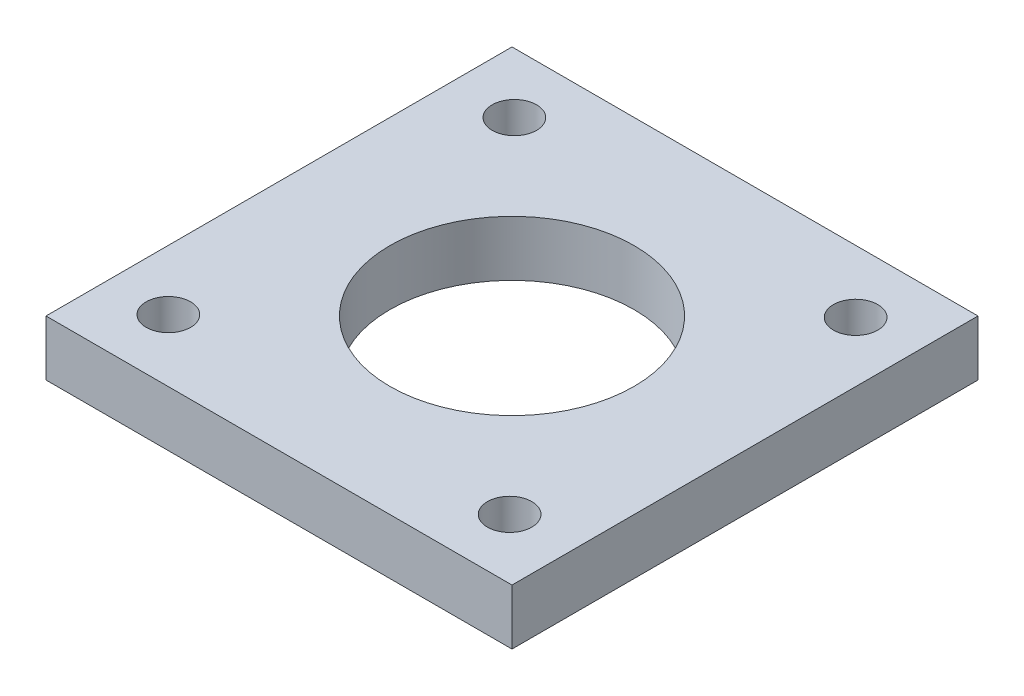
ISO-10303-21;
HEADER;
FILE_DESCRIPTION(('STEP AP214'),'2;1');
FILE_NAME('part.step','',(''),(''),'','','');
FILE_SCHEMA(('AUTOMOTIVE_DESIGN { 1 0 10303 214 1 1 1 1 }'));
ENDSEC;
DATA;
#1=APPLICATION_CONTEXT('core data for automotive mechanical design processes');
#2=APPLICATION_PROTOCOL_DEFINITION('international standard','automotive_design',2000,#1);
#3=PRODUCT_CONTEXT('',#1,'mechanical');
#4=PRODUCT('Part','Part','',(#3));
#5=PRODUCT_RELATED_PRODUCT_CATEGORY('part','',(#4));
#6=PRODUCT_DEFINITION_FORMATION('','',#4);
#7=PRODUCT_DEFINITION_CONTEXT('part definition',#1,'design');
#8=PRODUCT_DEFINITION('design','',#6,#7);
#9=PRODUCT_DEFINITION_SHAPE('','',#8);
#10=(LENGTH_UNIT() NAMED_UNIT(*) SI_UNIT(.MILLI.,.METRE.));
#11=(NAMED_UNIT(*) PLANE_ANGLE_UNIT() SI_UNIT($,.RADIAN.));
#12=(NAMED_UNIT(*) SI_UNIT($,.STERADIAN.) SOLID_ANGLE_UNIT());
#13=UNCERTAINTY_MEASURE_WITH_UNIT(LENGTH_MEASURE(1.E-05),#10,'distance_accuracy_value','');
#14=(GEOMETRIC_REPRESENTATION_CONTEXT(3) GLOBAL_UNCERTAINTY_ASSIGNED_CONTEXT((#13)) GLOBAL_UNIT_ASSIGNED_CONTEXT((#10,
#11,#12)) REPRESENTATION_CONTEXT('',''));
#15=CARTESIAN_POINT('',(0.,0.,0.));
#16=DIRECTION('',(0.,0.,1.));
#17=DIRECTION('',(1.,0.,0.));
#18=AXIS2_PLACEMENT_3D('',#15,#16,#17);
#19=CARTESIAN_POINT('',(0.,5.,0.));
#20=DIRECTION('',(0.,-1.,0.));
#21=DIRECTION('',(0.,0.,-1.));
#22=AXIS2_PLACEMENT_3D('',#19,#20,#21);
#23=PLANE('',#22);
#24=DIRECTION('',(0.,0.,-1.));
#25=VECTOR('',#24,1.);
#26=CARTESIAN_POINT('',(21.,5.,21.));
#27=LINE('',#26,#25);
#28=CARTESIAN_POINT('',(21.,5.,21.));
#29=VERTEX_POINT('',#28);
#30=CARTESIAN_POINT('',(21.,5.,-21.));
#31=VERTEX_POINT('',#30);
#32=EDGE_CURVE('E85',#29,#31,#27,.T.);
#33=ORIENTED_EDGE('',*,*,#32,.T.);
#34=DIRECTION('',(-1.,0.,0.));
#35=VECTOR('',#34,1.);
#36=CARTESIAN_POINT('',(-21.,5.,-21.));
#37=LINE('',#36,#35);
#38=CARTESIAN_POINT('',(-21.,5.,-21.));
#39=VERTEX_POINT('',#38);
#40=EDGE_CURVE('E80',#31,#39,#37,.T.);
#41=ORIENTED_EDGE('',*,*,#40,.T.);
#42=DIRECTION('',(0.,0.,1.));
#43=VECTOR('',#42,1.);
#44=CARTESIAN_POINT('',(-21.,5.,21.));
#45=LINE('',#44,#43);
#46=CARTESIAN_POINT('',(-21.,5.,21.));
#47=VERTEX_POINT('',#46);
#48=EDGE_CURVE('E83',#39,#47,#45,.T.);
#49=ORIENTED_EDGE('',*,*,#48,.T.);
#50=DIRECTION('',(1.,0.,0.));
#51=VECTOR('',#50,1.);
#52=CARTESIAN_POINT('',(-21.,5.,21.));
#53=LINE('',#52,#51);
#54=EDGE_CURVE('E50',#47,#29,#53,.T.);
#55=ORIENTED_EDGE('',*,*,#54,.T.);
#56=EDGE_LOOP('',(#33,#41,#49,#55));
#57=FACE_BOUND('',#56,.T.);
#58=CARTESIAN_POINT('',(0.,5.,0.));
#59=DIRECTION('',(0.,1.,0.));
#60=DIRECTION('',(0.,0.,1.));
#61=AXIS2_PLACEMENT_3D('',#58,#59,#60);
#62=CIRCLE('',#61,11.);
#63=CARTESIAN_POINT('',(0.,5.,11.));
#64=VERTEX_POINT('',#63);
#65=EDGE_CURVE('E100',#64,#64,#62,.T.);
#66=ORIENTED_EDGE('',*,*,#65,.F.);
#67=EDGE_LOOP('',(#66));
#68=FACE_BOUND('',#67,.T.);
#69=CARTESIAN_POINT('',(-15.592519129157,5.,15.3780150606921));
#70=DIRECTION('',(0.,1.,0.));
#71=DIRECTION('',(0.,0.,1.));
#72=AXIS2_PLACEMENT_3D('',#69,#70,#71);
#73=CIRCLE('',#72,2.);
#74=CARTESIAN_POINT('',(-15.592519129157,5.,17.3780150606921));
#75=VERTEX_POINT('',#74);
#76=EDGE_CURVE('E115',#75,#75,#73,.T.);
#77=ORIENTED_EDGE('',*,*,#76,.F.);
#78=EDGE_LOOP('',(#77));
#79=FACE_BOUND('',#78,.T.);
#80=CARTESIAN_POINT('',(-15.3780150606921,5.,-15.592519129157));
#81=DIRECTION('',(0.,1.,0.));
#82=DIRECTION('',(0.,0.,1.));
#83=AXIS2_PLACEMENT_3D('',#80,#81,#82);
#84=CIRCLE('',#83,2.);
#85=CARTESIAN_POINT('',(-15.3780150606921,5.,-13.592519129157));
#86=VERTEX_POINT('',#85);
#87=EDGE_CURVE('E121',#86,#86,#84,.T.);
#88=ORIENTED_EDGE('',*,*,#87,.F.);
#89=EDGE_LOOP('',(#88));
#90=FACE_BOUND('',#89,.T.);
#91=CARTESIAN_POINT('',(15.592519129157,5.,-15.3780150606921));
#92=DIRECTION('',(0.,1.,0.));
#93=DIRECTION('',(0.,0.,1.));
#94=AXIS2_PLACEMENT_3D('',#91,#92,#93);
#95=CIRCLE('',#94,2.);
#96=CARTESIAN_POINT('',(15.592519129157,5.,-13.3780150606921));
#97=VERTEX_POINT('',#96);
#98=EDGE_CURVE('E127',#97,#97,#95,.T.);
#99=ORIENTED_EDGE('',*,*,#98,.F.);
#100=EDGE_LOOP('',(#99));
#101=FACE_BOUND('',#100,.T.);
#102=CARTESIAN_POINT('',(15.3780150606921,5.,15.592519129157));
#103=DIRECTION('',(0.,1.,0.));
#104=DIRECTION('',(0.,0.,1.));
#105=AXIS2_PLACEMENT_3D('',#102,#103,#104);
#106=CIRCLE('',#105,2.);
#107=CARTESIAN_POINT('',(15.3780150606921,5.,17.592519129157));
#108=VERTEX_POINT('',#107);
#109=EDGE_CURVE('E133',#108,#108,#106,.T.);
#110=ORIENTED_EDGE('',*,*,#109,.F.);
#111=EDGE_LOOP('',(#110));
#112=FACE_BOUND('',#111,.T.);
#113=ADVANCED_FACE('F33',(#57,#68,#79,#90,#101,#112),#23,.F.);
#114=CARTESIAN_POINT('',(0.,0.,0.));
#115=DIRECTION('',(0.,-1.,0.));
#116=DIRECTION('',(0.,0.,-1.));
#117=AXIS2_PLACEMENT_3D('',#114,#115,#116);
#118=PLANE('',#117);
#119=CARTESIAN_POINT('',(15.592519129157,0.,-15.3780150606921));
#120=DIRECTION('',(0.,1.,0.));
#121=DIRECTION('',(0.,0.,1.));
#122=AXIS2_PLACEMENT_3D('',#119,#120,#121);
#123=CIRCLE('',#122,2.);
#124=CARTESIAN_POINT('',(15.592519129157,0.,-13.3780150606921));
#125=VERTEX_POINT('',#124);
#126=EDGE_CURVE('E130',#125,#125,#123,.T.);
#127=ORIENTED_EDGE('',*,*,#126,.T.);
#128=EDGE_LOOP('',(#127));
#129=FACE_BOUND('',#128,.T.);
#130=CARTESIAN_POINT('',(-15.592519129157,0.,15.3780150606921));
#131=DIRECTION('',(0.,1.,0.));
#132=DIRECTION('',(0.,0.,1.));
#133=AXIS2_PLACEMENT_3D('',#130,#131,#132);
#134=CIRCLE('',#133,2.);
#135=CARTESIAN_POINT('',(-15.592519129157,0.,17.3780150606921));
#136=VERTEX_POINT('',#135);
#137=EDGE_CURVE('E118',#136,#136,#134,.T.);
#138=ORIENTED_EDGE('',*,*,#137,.T.);
#139=EDGE_LOOP('',(#138));
#140=FACE_BOUND('',#139,.T.);
#141=DIRECTION('',(0.,0.,-1.));
#142=VECTOR('',#141,1.);
#143=CARTESIAN_POINT('',(21.,0.,21.));
#144=LINE('',#143,#142);
#145=CARTESIAN_POINT('',(21.,0.,21.));
#146=VERTEX_POINT('',#145);
#147=CARTESIAN_POINT('',(21.,0.,-21.));
#148=VERTEX_POINT('',#147);
#149=EDGE_CURVE('E97',#146,#148,#144,.T.);
#150=ORIENTED_EDGE('',*,*,#149,.F.);
#151=DIRECTION('',(1.,0.,0.));
#152=VECTOR('',#151,1.);
#153=CARTESIAN_POINT('',(-21.,0.,21.));
#154=LINE('',#153,#152);
#155=CARTESIAN_POINT('',(-21.,0.,21.));
#156=VERTEX_POINT('',#155);
#157=EDGE_CURVE('E73',#156,#146,#154,.T.);
#158=ORIENTED_EDGE('',*,*,#157,.F.);
#159=DIRECTION('',(0.,0.,1.));
#160=VECTOR('',#159,1.);
#161=CARTESIAN_POINT('',(-21.,0.,21.));
#162=LINE('',#161,#160);
#163=CARTESIAN_POINT('',(-21.,0.,-21.));
#164=VERTEX_POINT('',#163);
#165=EDGE_CURVE('E67',#164,#156,#162,.T.);
#166=ORIENTED_EDGE('',*,*,#165,.F.);
#167=DIRECTION('',(-1.,0.,0.));
#168=VECTOR('',#167,1.);
#169=CARTESIAN_POINT('',(-21.,0.,-21.));
#170=LINE('',#169,#168);
#171=EDGE_CURVE('E89',#148,#164,#170,.T.);
#172=ORIENTED_EDGE('',*,*,#171,.F.);
#173=EDGE_LOOP('',(#150,#158,#166,#172));
#174=FACE_BOUND('',#173,.T.);
#175=CARTESIAN_POINT('',(0.,0.,0.));
#176=DIRECTION('',(0.,1.,0.));
#177=DIRECTION('',(0.,0.,1.));
#178=AXIS2_PLACEMENT_3D('',#175,#176,#177);
#179=CIRCLE('',#178,11.);
#180=CARTESIAN_POINT('',(0.,0.,11.));
#181=VERTEX_POINT('',#180);
#182=EDGE_CURVE('E112',#181,#181,#179,.T.);
#183=ORIENTED_EDGE('',*,*,#182,.T.);
#184=EDGE_LOOP('',(#183));
#185=FACE_BOUND('',#184,.T.);
#186=CARTESIAN_POINT('',(-15.3780150606921,0.,-15.592519129157));
#187=DIRECTION('',(0.,1.,0.));
#188=DIRECTION('',(0.,0.,1.));
#189=AXIS2_PLACEMENT_3D('',#186,#187,#188);
#190=CIRCLE('',#189,2.);
#191=CARTESIAN_POINT('',(-15.3780150606921,0.,-13.592519129157));
#192=VERTEX_POINT('',#191);
#193=EDGE_CURVE('E124',#192,#192,#190,.T.);
#194=ORIENTED_EDGE('',*,*,#193,.T.);
#195=EDGE_LOOP('',(#194));
#196=FACE_BOUND('',#195,.T.);
#197=CARTESIAN_POINT('',(15.3780150606921,0.,15.592519129157));
#198=DIRECTION('',(0.,1.,0.));
#199=DIRECTION('',(0.,0.,1.));
#200=AXIS2_PLACEMENT_3D('',#197,#198,#199);
#201=CIRCLE('',#200,2.);
#202=CARTESIAN_POINT('',(15.3780150606921,0.,17.592519129157));
#203=VERTEX_POINT('',#202);
#204=EDGE_CURVE('E136',#203,#203,#201,.T.);
#205=ORIENTED_EDGE('',*,*,#204,.T.);
#206=EDGE_LOOP('',(#205));
#207=FACE_BOUND('',#206,.T.);
#208=ADVANCED_FACE('F108',(#129,#140,#174,#185,#196,#207),#118,.T.);
#209=CARTESIAN_POINT('',(21.,5.,21.));
#210=DIRECTION('',(-1.,0.,0.));
#211=DIRECTION('',(0.,0.,1.));
#212=AXIS2_PLACEMENT_3D('',#209,#210,#211);
#213=PLANE('',#212);
#214=ORIENTED_EDGE('',*,*,#149,.T.);
#215=DIRECTION('',(0.,-1.,0.));
#216=VECTOR('',#215,1.);
#217=CARTESIAN_POINT('',(21.,5.,-21.));
#218=LINE('',#217,#216);
#219=EDGE_CURVE('E11',#31,#148,#218,.T.);
#220=ORIENTED_EDGE('',*,*,#219,.F.);
#221=ORIENTED_EDGE('',*,*,#32,.F.);
#222=DIRECTION('',(0.,-1.,0.));
#223=VECTOR('',#222,1.);
#224=CARTESIAN_POINT('',(21.,5.,21.));
#225=LINE('',#224,#223);
#226=EDGE_CURVE('E93',#29,#146,#225,.T.);
#227=ORIENTED_EDGE('',*,*,#226,.T.);
#228=EDGE_LOOP('',(#214,#220,#221,#227));
#229=FACE_BOUND('',#228,.T.);
#230=ADVANCED_FACE('F35',(#229),#213,.F.);
#231=CARTESIAN_POINT('',(-21.,5.,-21.));
#232=DIRECTION('',(0.,0.,1.));
#233=DIRECTION('',(1.,0.,0.));
#234=AXIS2_PLACEMENT_3D('',#231,#232,#233);
#235=PLANE('',#234);
#236=ORIENTED_EDGE('',*,*,#171,.T.);
#237=DIRECTION('',(0.,-1.,0.));
#238=VECTOR('',#237,1.);
#239=CARTESIAN_POINT('',(-21.,5.,-21.));
#240=LINE('',#239,#238);
#241=EDGE_CURVE('E42',#39,#164,#240,.T.);
#242=ORIENTED_EDGE('',*,*,#241,.F.);
#243=ORIENTED_EDGE('',*,*,#40,.F.);
#244=ORIENTED_EDGE('',*,*,#219,.T.);
#245=EDGE_LOOP('',(#236,#242,#243,#244));
#246=FACE_BOUND('',#245,.T.);
#247=ADVANCED_FACE('F88',(#246),#235,.F.);
#248=CARTESIAN_POINT('',(-21.,5.,21.));
#249=DIRECTION('',(1.,0.,0.));
#250=DIRECTION('',(0.,0.,-1.));
#251=AXIS2_PLACEMENT_3D('',#248,#249,#250);
#252=PLANE('',#251);
#253=ORIENTED_EDGE('',*,*,#165,.T.);
#254=DIRECTION('',(0.,-1.,0.));
#255=VECTOR('',#254,1.);
#256=CARTESIAN_POINT('',(-21.,5.,21.));
#257=LINE('',#256,#255);
#258=EDGE_CURVE('E90',#47,#156,#257,.T.);
#259=ORIENTED_EDGE('',*,*,#258,.F.);
#260=ORIENTED_EDGE('',*,*,#48,.F.);
#261=ORIENTED_EDGE('',*,*,#241,.T.);
#262=EDGE_LOOP('',(#253,#259,#260,#261));
#263=FACE_BOUND('',#262,.T.);
#264=ADVANCED_FACE('F91',(#263),#252,.F.);
#265=CARTESIAN_POINT('',(-21.,5.,21.));
#266=DIRECTION('',(0.,0.,-1.));
#267=DIRECTION('',(-1.,0.,0.));
#268=AXIS2_PLACEMENT_3D('',#265,#266,#267);
#269=PLANE('',#268);
#270=ORIENTED_EDGE('',*,*,#157,.T.);
#271=ORIENTED_EDGE('',*,*,#226,.F.);
#272=ORIENTED_EDGE('',*,*,#54,.F.);
#273=ORIENTED_EDGE('',*,*,#258,.T.);
#274=EDGE_LOOP('',(#270,#271,#272,#273));
#275=FACE_BOUND('',#274,.T.);
#276=ADVANCED_FACE('F105',(#275),#269,.F.);
#277=CARTESIAN_POINT('',(0.,5.,0.));
#278=DIRECTION('',(0.,-1.,0.));
#279=DIRECTION('',(0.,0.,-1.));
#280=AXIS2_PLACEMENT_3D('',#277,#278,#279);
#281=CYLINDRICAL_SURFACE('',#280,11.);
#282=ORIENTED_EDGE('',*,*,#65,.T.);
#283=EDGE_LOOP('',(#282));
#284=FACE_BOUND('',#283,.T.);
#285=ORIENTED_EDGE('',*,*,#182,.F.);
#286=EDGE_LOOP('',(#285));
#287=FACE_BOUND('',#286,.T.);
#288=ADVANCED_FACE('F153',(#284,#287),#281,.F.);
#289=CARTESIAN_POINT('',(-15.592519129157,5.,15.3780150606921));
#290=DIRECTION('',(0.,-1.,0.));
#291=DIRECTION('',(0.,0.,-1.));
#292=AXIS2_PLACEMENT_3D('',#289,#290,#291);
#293=CYLINDRICAL_SURFACE('',#292,2.);
#294=ORIENTED_EDGE('',*,*,#76,.T.);
#295=EDGE_LOOP('',(#294));
#296=FACE_BOUND('',#295,.T.);
#297=ORIENTED_EDGE('',*,*,#137,.F.);
#298=EDGE_LOOP('',(#297));
#299=FACE_BOUND('',#298,.T.);
#300=ADVANCED_FACE('F199',(#296,#299),#293,.F.);
#301=CARTESIAN_POINT('',(-15.3780150606921,5.,-15.592519129157));
#302=DIRECTION('',(0.,-1.,0.));
#303=DIRECTION('',(0.,0.,-1.));
#304=AXIS2_PLACEMENT_3D('',#301,#302,#303);
#305=CYLINDRICAL_SURFACE('',#304,2.);
#306=ORIENTED_EDGE('',*,*,#87,.T.);
#307=EDGE_LOOP('',(#306));
#308=FACE_BOUND('',#307,.T.);
#309=ORIENTED_EDGE('',*,*,#193,.F.);
#310=EDGE_LOOP('',(#309));
#311=FACE_BOUND('',#310,.T.);
#312=ADVANCED_FACE('F207',(#308,#311),#305,.F.);
#313=CARTESIAN_POINT('',(15.592519129157,5.,-15.3780150606921));
#314=DIRECTION('',(0.,-1.,0.));
#315=DIRECTION('',(0.,0.,-1.));
#316=AXIS2_PLACEMENT_3D('',#313,#314,#315);
#317=CYLINDRICAL_SURFACE('',#316,2.);
#318=ORIENTED_EDGE('',*,*,#98,.T.);
#319=EDGE_LOOP('',(#318));
#320=FACE_BOUND('',#319,.T.);
#321=ORIENTED_EDGE('',*,*,#126,.F.);
#322=EDGE_LOOP('',(#321));
#323=FACE_BOUND('',#322,.T.);
#324=ADVANCED_FACE('F215',(#320,#323),#317,.F.);
#325=CARTESIAN_POINT('',(15.3780150606921,5.,15.592519129157));
#326=DIRECTION('',(0.,-1.,0.));
#327=DIRECTION('',(0.,0.,-1.));
#328=AXIS2_PLACEMENT_3D('',#325,#326,#327);
#329=CYLINDRICAL_SURFACE('',#328,2.);
#330=ORIENTED_EDGE('',*,*,#109,.T.);
#331=EDGE_LOOP('',(#330));
#332=FACE_BOUND('',#331,.T.);
#333=ORIENTED_EDGE('',*,*,#204,.F.);
#334=EDGE_LOOP('',(#333));
#335=FACE_BOUND('',#334,.T.);
#336=ADVANCED_FACE('F142',(#332,#335),#329,.F.);
#337=CLOSED_SHELL('',(#113,#208,#230,#247,#264,#276,#288,#300,#312,#324,#336));
#338=MANIFOLD_SOLID_BREP('B2',#337);
#339=ADVANCED_BREP_SHAPE_REPRESENTATION('',(#18,#338),#14);
#340=SHAPE_DEFINITION_REPRESENTATION(#9,#339);
ENDSEC;
END-ISO-10303-21;
